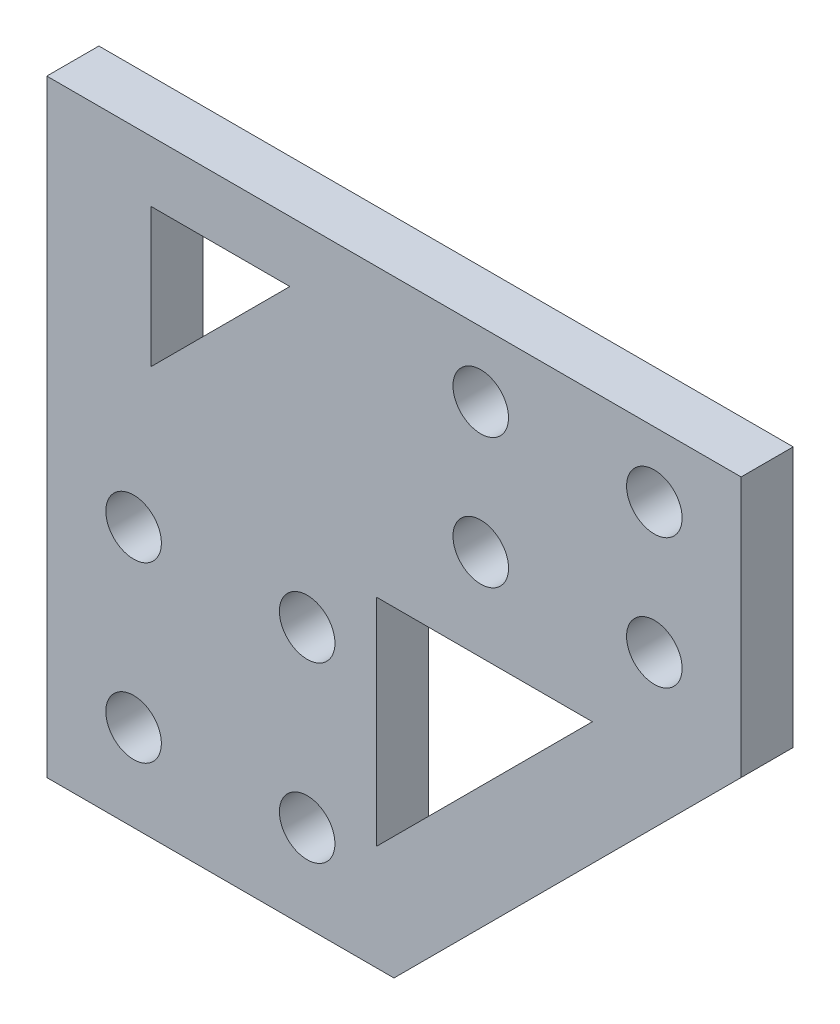
ISO-10303-21;
HEADER;
FILE_DESCRIPTION(('STEP AP214'),'2;1');
FILE_NAME('part.step','',(''),(''),'','','');
FILE_SCHEMA(('AUTOMOTIVE_DESIGN { 1 0 10303 214 1 1 1 1 }'));
ENDSEC;
DATA;
#1=APPLICATION_CONTEXT('core data for automotive mechanical design processes');
#2=APPLICATION_PROTOCOL_DEFINITION('international standard','automotive_design',2000,#1);
#3=PRODUCT_CONTEXT('',#1,'mechanical');
#4=PRODUCT('Part','Part','',(#3));
#5=PRODUCT_RELATED_PRODUCT_CATEGORY('part','',(#4));
#6=PRODUCT_DEFINITION_FORMATION('','',#4);
#7=PRODUCT_DEFINITION_CONTEXT('part definition',#1,'design');
#8=PRODUCT_DEFINITION('design','',#6,#7);
#9=PRODUCT_DEFINITION_SHAPE('','',#8);
#10=(LENGTH_UNIT() NAMED_UNIT(*) SI_UNIT(.MILLI.,.METRE.));
#11=(NAMED_UNIT(*) PLANE_ANGLE_UNIT() SI_UNIT($,.RADIAN.));
#12=(NAMED_UNIT(*) SI_UNIT($,.STERADIAN.) SOLID_ANGLE_UNIT());
#13=UNCERTAINTY_MEASURE_WITH_UNIT(LENGTH_MEASURE(1.E-05),#10,'distance_accuracy_value','');
#14=(GEOMETRIC_REPRESENTATION_CONTEXT(3) GLOBAL_UNCERTAINTY_ASSIGNED_CONTEXT((#13)) GLOBAL_UNIT_ASSIGNED_CONTEXT((#10,
#11,#12)) REPRESENTATION_CONTEXT('',''));
#15=CARTESIAN_POINT('',(0.,0.,0.));
#16=DIRECTION('',(0.,0.,1.));
#17=DIRECTION('',(1.,0.,0.));
#18=AXIS2_PLACEMENT_3D('',#15,#16,#17);
#19=CARTESIAN_POINT('',(0.,0.,3.));
#20=DIRECTION('',(0.,0.,-1.));
#21=DIRECTION('',(-1.,0.,0.));
#22=AXIS2_PLACEMENT_3D('',#19,#20,#21);
#23=PLANE('',#22);
#24=DIRECTION('',(-1.,0.,0.));
#25=VECTOR('',#24,1.);
#26=CARTESIAN_POINT('',(31.4289321881345,-16.5,3.));
#27=LINE('',#26,#25);
#28=CARTESIAN_POINT('',(31.4289321881345,-16.5,3.));
#29=VERTEX_POINT('',#28);
#30=CARTESIAN_POINT('',(19.,-16.5,3.));
#31=VERTEX_POINT('',#30);
#32=EDGE_CURVE('E163',#29,#31,#27,.T.);
#33=ORIENTED_EDGE('',*,*,#32,.F.);
#34=DIRECTION('',(0.707106781186547,0.707106781186548,0.));
#35=VECTOR('',#34,1.);
#36=CARTESIAN_POINT('',(19.,-28.9289321881345,3.));
#37=LINE('',#36,#35);
#38=CARTESIAN_POINT('',(19.,-28.9289321881345,3.));
#39=VERTEX_POINT('',#38);
#40=EDGE_CURVE('E171',#39,#29,#37,.T.);
#41=ORIENTED_EDGE('',*,*,#40,.F.);
#42=DIRECTION('',(0.,-1.,0.));
#43=VECTOR('',#42,1.);
#44=CARTESIAN_POINT('',(19.,-16.5,3.));
#45=LINE('',#44,#43);
#46=EDGE_CURVE('E166',#31,#39,#45,.T.);
#47=ORIENTED_EDGE('',*,*,#46,.F.);
#48=EDGE_LOOP('',(#33,#41,#47));
#49=FACE_BOUND('',#48,.T.);
#50=DIRECTION('',(0.,-1.,0.));
#51=VECTOR('',#50,1.);
#52=CARTESIAN_POINT('',(0.,-35.,3.));
#53=LINE('',#52,#51);
#54=CARTESIAN_POINT('',(0.,0.,3.));
#55=VERTEX_POINT('',#54);
#56=CARTESIAN_POINT('',(0.,-35.,3.));
#57=VERTEX_POINT('',#56);
#58=EDGE_CURVE('E260',#55,#57,#53,.T.);
#59=ORIENTED_EDGE('',*,*,#58,.T.);
#60=DIRECTION('',(1.,0.,0.));
#61=VECTOR('',#60,1.);
#62=CARTESIAN_POINT('',(20.,-35.,3.));
#63=LINE('',#62,#61);
#64=CARTESIAN_POINT('',(20.,-35.,3.));
#65=VERTEX_POINT('',#64);
#66=EDGE_CURVE('E264',#57,#65,#63,.T.);
#67=ORIENTED_EDGE('',*,*,#66,.T.);
#68=DIRECTION('',(0.707106781186547,0.707106781186548,0.));
#69=VECTOR('',#68,1.);
#70=CARTESIAN_POINT('',(40.,-15.,3.));
#71=LINE('',#70,#69);
#72=CARTESIAN_POINT('',(40.,-15.,3.));
#73=VERTEX_POINT('',#72);
#74=EDGE_CURVE('E268',#65,#73,#71,.T.);
#75=ORIENTED_EDGE('',*,*,#74,.T.);
#76=DIRECTION('',(0.,1.,0.));
#77=VECTOR('',#76,1.);
#78=CARTESIAN_POINT('',(40.,0.,3.));
#79=LINE('',#78,#77);
#80=CARTESIAN_POINT('',(40.,0.,3.));
#81=VERTEX_POINT('',#80);
#82=EDGE_CURVE('E271',#73,#81,#79,.T.);
#83=ORIENTED_EDGE('',*,*,#82,.T.);
#84=DIRECTION('',(-1.,0.,0.));
#85=VECTOR('',#84,1.);
#86=CARTESIAN_POINT('',(0.,0.,3.));
#87=LINE('',#86,#85);
#88=EDGE_CURVE('E274',#81,#55,#87,.T.);
#89=ORIENTED_EDGE('',*,*,#88,.T.);
#90=EDGE_LOOP('',(#59,#67,#75,#83,#89));
#91=FACE_BOUND('',#90,.T.);
#92=CARTESIAN_POINT('',(5.00000000000001,-30.,3.));
#93=DIRECTION('',(0.,0.,1.));
#94=DIRECTION('',(1.,0.,0.));
#95=AXIS2_PLACEMENT_3D('',#92,#93,#94);
#96=CIRCLE('',#95,1.59999999999999);
#97=CARTESIAN_POINT('',(6.6,-30.,3.));
#98=VERTEX_POINT('',#97);
#99=EDGE_CURVE('E252',#98,#98,#96,.T.);
#100=ORIENTED_EDGE('',*,*,#99,.F.);
#101=EDGE_LOOP('',(#100));
#102=FACE_BOUND('',#101,.T.);
#103=CARTESIAN_POINT('',(15.,-30.,3.));
#104=DIRECTION('',(0.,0.,1.));
#105=DIRECTION('',(-1.,0.,0.));
#106=AXIS2_PLACEMENT_3D('',#103,#104,#105);
#107=CIRCLE('',#106,1.6);
#108=CARTESIAN_POINT('',(13.4,-30.,3.));
#109=VERTEX_POINT('',#108);
#110=EDGE_CURVE('E244',#109,#109,#107,.T.);
#111=ORIENTED_EDGE('',*,*,#110,.F.);
#112=EDGE_LOOP('',(#111));
#113=FACE_BOUND('',#112,.T.);
#114=CARTESIAN_POINT('',(15.,-20.,3.));
#115=DIRECTION('',(0.,0.,1.));
#116=DIRECTION('',(1.,0.,0.));
#117=AXIS2_PLACEMENT_3D('',#114,#115,#116);
#118=CIRCLE('',#117,1.6);
#119=CARTESIAN_POINT('',(16.6,-20.,3.));
#120=VERTEX_POINT('',#119);
#121=EDGE_CURVE('E236',#120,#120,#118,.T.);
#122=ORIENTED_EDGE('',*,*,#121,.F.);
#123=EDGE_LOOP('',(#122));
#124=FACE_BOUND('',#123,.T.);
#125=CARTESIAN_POINT('',(5.00000000000001,-20.,3.));
#126=DIRECTION('',(0.,0.,1.));
#127=DIRECTION('',(-1.,0.,0.));
#128=AXIS2_PLACEMENT_3D('',#125,#126,#127);
#129=CIRCLE('',#128,1.6);
#130=CARTESIAN_POINT('',(3.40000000000001,-20.,3.));
#131=VERTEX_POINT('',#130);
#132=EDGE_CURVE('E228',#131,#131,#129,.T.);
#133=ORIENTED_EDGE('',*,*,#132,.F.);
#134=EDGE_LOOP('',(#133));
#135=FACE_BOUND('',#134,.T.);
#136=CARTESIAN_POINT('',(35.,-3.75,3.));
#137=DIRECTION('',(0.,0.,1.));
#138=DIRECTION('',(1.,0.,0.));
#139=AXIS2_PLACEMENT_3D('',#136,#137,#138);
#140=CIRCLE('',#139,1.6);
#141=CARTESIAN_POINT('',(36.6,-3.75,3.));
#142=VERTEX_POINT('',#141);
#143=EDGE_CURVE('E220',#142,#142,#140,.T.);
#144=ORIENTED_EDGE('',*,*,#143,.F.);
#145=EDGE_LOOP('',(#144));
#146=FACE_BOUND('',#145,.T.);
#147=CARTESIAN_POINT('',(35.,-11.25,3.));
#148=DIRECTION('',(0.,0.,1.));
#149=DIRECTION('',(-1.,0.,0.));
#150=AXIS2_PLACEMENT_3D('',#147,#148,#149);
#151=CIRCLE('',#150,1.6);
#152=CARTESIAN_POINT('',(33.4,-11.25,3.));
#153=VERTEX_POINT('',#152);
#154=EDGE_CURVE('E212',#153,#153,#151,.T.);
#155=ORIENTED_EDGE('',*,*,#154,.F.);
#156=EDGE_LOOP('',(#155));
#157=FACE_BOUND('',#156,.T.);
#158=CARTESIAN_POINT('',(25.,-11.25,3.));
#159=DIRECTION('',(0.,0.,1.));
#160=DIRECTION('',(1.,0.,0.));
#161=AXIS2_PLACEMENT_3D('',#158,#159,#160);
#162=CIRCLE('',#161,1.6);
#163=CARTESIAN_POINT('',(26.6,-11.25,3.));
#164=VERTEX_POINT('',#163);
#165=EDGE_CURVE('E204',#164,#164,#162,.T.);
#166=ORIENTED_EDGE('',*,*,#165,.F.);
#167=EDGE_LOOP('',(#166));
#168=FACE_BOUND('',#167,.T.);
#169=CARTESIAN_POINT('',(25.,-3.75,3.));
#170=DIRECTION('',(0.,0.,1.));
#171=DIRECTION('',(-1.,0.,0.));
#172=AXIS2_PLACEMENT_3D('',#169,#170,#171);
#173=CIRCLE('',#172,1.6);
#174=CARTESIAN_POINT('',(23.4,-3.75,3.));
#175=VERTEX_POINT('',#174);
#176=EDGE_CURVE('E196',#175,#175,#173,.T.);
#177=ORIENTED_EDGE('',*,*,#176,.F.);
#178=EDGE_LOOP('',(#177));
#179=FACE_BOUND('',#178,.T.);
#180=DIRECTION('',(0.,-1.,0.));
#181=VECTOR('',#180,1.);
#182=CARTESIAN_POINT('',(6.,-3.5,3.));
#183=LINE('',#182,#181);
#184=CARTESIAN_POINT('',(6.,-3.5,3.));
#185=VERTEX_POINT('',#184);
#186=CARTESIAN_POINT('',(6.,-11.5,3.));
#187=VERTEX_POINT('',#186);
#188=EDGE_CURVE('E127',#185,#187,#183,.T.);
#189=ORIENTED_EDGE('',*,*,#188,.F.);
#190=DIRECTION('',(-1.,0.,0.));
#191=VECTOR('',#190,1.);
#192=CARTESIAN_POINT('',(6.,-3.5,3.));
#193=LINE('',#192,#191);
#194=CARTESIAN_POINT('',(14.,-3.5,3.));
#195=VERTEX_POINT('',#194);
#196=EDGE_CURVE('E146',#195,#185,#193,.T.);
#197=ORIENTED_EDGE('',*,*,#196,.F.);
#198=DIRECTION('',(0.707106781186547,0.707106781186548,0.));
#199=VECTOR('',#198,1.);
#200=CARTESIAN_POINT('',(14.,-3.5,3.));
#201=LINE('',#200,#199);
#202=EDGE_CURVE('E136',#187,#195,#201,.T.);
#203=ORIENTED_EDGE('',*,*,#202,.F.);
#204=EDGE_LOOP('',(#189,#197,#203));
#205=FACE_BOUND('',#204,.T.);
#206=ADVANCED_FACE('F43',(#49,#91,#102,#113,#124,#135,#146,#157,#168,#179,#205),#23,.F.);
#207=CARTESIAN_POINT('',(0.,0.,0.));
#208=DIRECTION('',(0.,0.,-1.));
#209=DIRECTION('',(-1.,0.,0.));
#210=AXIS2_PLACEMENT_3D('',#207,#208,#209);
#211=PLANE('',#210);
#212=CARTESIAN_POINT('',(25.,-11.25,0.));
#213=DIRECTION('',(0.,0.,1.));
#214=DIRECTION('',(1.,0.,0.));
#215=AXIS2_PLACEMENT_3D('',#212,#213,#214);
#216=CIRCLE('',#215,1.6);
#217=CARTESIAN_POINT('',(26.6,-11.25,0.));
#218=VERTEX_POINT('',#217);
#219=EDGE_CURVE('E200',#218,#218,#216,.T.);
#220=ORIENTED_EDGE('',*,*,#219,.T.);
#221=EDGE_LOOP('',(#220));
#222=FACE_BOUND('',#221,.T.);
#223=CARTESIAN_POINT('',(35.,-3.75,0.));
#224=DIRECTION('',(0.,0.,1.));
#225=DIRECTION('',(1.,0.,0.));
#226=AXIS2_PLACEMENT_3D('',#223,#224,#225);
#227=CIRCLE('',#226,1.6);
#228=CARTESIAN_POINT('',(36.6,-3.75,0.));
#229=VERTEX_POINT('',#228);
#230=EDGE_CURVE('E216',#229,#229,#227,.T.);
#231=ORIENTED_EDGE('',*,*,#230,.T.);
#232=EDGE_LOOP('',(#231));
#233=FACE_BOUND('',#232,.T.);
#234=CARTESIAN_POINT('',(15.,-20.,0.));
#235=DIRECTION('',(0.,0.,1.));
#236=DIRECTION('',(1.,0.,0.));
#237=AXIS2_PLACEMENT_3D('',#234,#235,#236);
#238=CIRCLE('',#237,1.6);
#239=CARTESIAN_POINT('',(16.6,-20.,0.));
#240=VERTEX_POINT('',#239);
#241=EDGE_CURVE('E232',#240,#240,#238,.T.);
#242=ORIENTED_EDGE('',*,*,#241,.T.);
#243=EDGE_LOOP('',(#242));
#244=FACE_BOUND('',#243,.T.);
#245=CARTESIAN_POINT('',(5.00000000000001,-30.,0.));
#246=DIRECTION('',(0.,0.,1.));
#247=DIRECTION('',(1.,0.,0.));
#248=AXIS2_PLACEMENT_3D('',#245,#246,#247);
#249=CIRCLE('',#248,1.59999999999999);
#250=CARTESIAN_POINT('',(6.6,-30.,0.));
#251=VERTEX_POINT('',#250);
#252=EDGE_CURVE('E248',#251,#251,#249,.T.);
#253=ORIENTED_EDGE('',*,*,#252,.T.);
#254=EDGE_LOOP('',(#253));
#255=FACE_BOUND('',#254,.T.);
#256=DIRECTION('',(0.,-1.,0.));
#257=VECTOR('',#256,1.);
#258=CARTESIAN_POINT('',(0.,-35.,0.));
#259=LINE('',#258,#257);
#260=CARTESIAN_POINT('',(0.,0.,0.));
#261=VERTEX_POINT('',#260);
#262=CARTESIAN_POINT('',(0.,-35.,0.));
#263=VERTEX_POINT('',#262);
#264=EDGE_CURVE('E256',#261,#263,#259,.T.);
#265=ORIENTED_EDGE('',*,*,#264,.F.);
#266=DIRECTION('',(-1.,0.,0.));
#267=VECTOR('',#266,1.);
#268=CARTESIAN_POINT('',(0.,0.,0.));
#269=LINE('',#268,#267);
#270=CARTESIAN_POINT('',(40.,0.,0.));
#271=VERTEX_POINT('',#270);
#272=EDGE_CURVE('E265',#271,#261,#269,.T.);
#273=ORIENTED_EDGE('',*,*,#272,.F.);
#274=DIRECTION('',(0.,1.,0.));
#275=VECTOR('',#274,1.);
#276=CARTESIAN_POINT('',(40.,0.,0.));
#277=LINE('',#276,#275);
#278=CARTESIAN_POINT('',(40.,-15.,0.));
#279=VERTEX_POINT('',#278);
#280=EDGE_CURVE('E287',#279,#271,#277,.T.);
#281=ORIENTED_EDGE('',*,*,#280,.F.);
#282=DIRECTION('',(0.707106781186547,0.707106781186548,0.));
#283=VECTOR('',#282,1.);
#284=CARTESIAN_POINT('',(40.,-15.,0.));
#285=LINE('',#284,#283);
#286=CARTESIAN_POINT('',(20.,-35.,0.));
#287=VERTEX_POINT('',#286);
#288=EDGE_CURVE('E284',#287,#279,#285,.T.);
#289=ORIENTED_EDGE('',*,*,#288,.F.);
#290=DIRECTION('',(1.,0.,0.));
#291=VECTOR('',#290,1.);
#292=CARTESIAN_POINT('',(20.,-35.,0.));
#293=LINE('',#292,#291);
#294=EDGE_CURVE('E281',#263,#287,#293,.T.);
#295=ORIENTED_EDGE('',*,*,#294,.F.);
#296=EDGE_LOOP('',(#265,#273,#281,#289,#295));
#297=FACE_BOUND('',#296,.T.);
#298=CARTESIAN_POINT('',(15.,-30.,0.));
#299=DIRECTION('',(0.,0.,1.));
#300=DIRECTION('',(-1.,0.,0.));
#301=AXIS2_PLACEMENT_3D('',#298,#299,#300);
#302=CIRCLE('',#301,1.6);
#303=CARTESIAN_POINT('',(13.4,-30.,0.));
#304=VERTEX_POINT('',#303);
#305=EDGE_CURVE('E240',#304,#304,#302,.T.);
#306=ORIENTED_EDGE('',*,*,#305,.T.);
#307=EDGE_LOOP('',(#306));
#308=FACE_BOUND('',#307,.T.);
#309=CARTESIAN_POINT('',(5.00000000000001,-20.,0.));
#310=DIRECTION('',(0.,0.,1.));
#311=DIRECTION('',(-1.,0.,0.));
#312=AXIS2_PLACEMENT_3D('',#309,#310,#311);
#313=CIRCLE('',#312,1.6);
#314=CARTESIAN_POINT('',(3.40000000000001,-20.,0.));
#315=VERTEX_POINT('',#314);
#316=EDGE_CURVE('E224',#315,#315,#313,.T.);
#317=ORIENTED_EDGE('',*,*,#316,.T.);
#318=EDGE_LOOP('',(#317));
#319=FACE_BOUND('',#318,.T.);
#320=CARTESIAN_POINT('',(35.,-11.25,0.));
#321=DIRECTION('',(0.,0.,1.));
#322=DIRECTION('',(-1.,0.,0.));
#323=AXIS2_PLACEMENT_3D('',#320,#321,#322);
#324=CIRCLE('',#323,1.6);
#325=CARTESIAN_POINT('',(33.4,-11.25,0.));
#326=VERTEX_POINT('',#325);
#327=EDGE_CURVE('E208',#326,#326,#324,.T.);
#328=ORIENTED_EDGE('',*,*,#327,.T.);
#329=EDGE_LOOP('',(#328));
#330=FACE_BOUND('',#329,.T.);
#331=CARTESIAN_POINT('',(25.,-3.75,0.));
#332=DIRECTION('',(0.,0.,1.));
#333=DIRECTION('',(-1.,0.,0.));
#334=AXIS2_PLACEMENT_3D('',#331,#332,#333);
#335=CIRCLE('',#334,1.6);
#336=CARTESIAN_POINT('',(23.4,-3.75,0.));
#337=VERTEX_POINT('',#336);
#338=EDGE_CURVE('E195',#337,#337,#335,.T.);
#339=ORIENTED_EDGE('',*,*,#338,.T.);
#340=EDGE_LOOP('',(#339));
#341=FACE_BOUND('',#340,.T.);
#342=DIRECTION('',(0.707106781186547,0.707106781186548,0.));
#343=VECTOR('',#342,1.);
#344=CARTESIAN_POINT('',(19.,-28.9289321881345,0.));
#345=LINE('',#344,#343);
#346=CARTESIAN_POINT('',(19.,-28.9289321881345,0.));
#347=VERTEX_POINT('',#346);
#348=CARTESIAN_POINT('',(31.4289321881345,-16.5,0.));
#349=VERTEX_POINT('',#348);
#350=EDGE_CURVE('E167',#347,#349,#345,.T.);
#351=ORIENTED_EDGE('',*,*,#350,.T.);
#352=DIRECTION('',(-1.,0.,0.));
#353=VECTOR('',#352,1.);
#354=CARTESIAN_POINT('',(31.4289321881345,-16.5,0.));
#355=LINE('',#354,#353);
#356=CARTESIAN_POINT('',(19.,-16.5,0.));
#357=VERTEX_POINT('',#356);
#358=EDGE_CURVE('E144',#349,#357,#355,.T.);
#359=ORIENTED_EDGE('',*,*,#358,.T.);
#360=DIRECTION('',(0.,-1.,0.));
#361=VECTOR('',#360,1.);
#362=CARTESIAN_POINT('',(19.,-16.5,0.));
#363=LINE('',#362,#361);
#364=EDGE_CURVE('E178',#357,#347,#363,.T.);
#365=ORIENTED_EDGE('',*,*,#364,.T.);
#366=EDGE_LOOP('',(#351,#359,#365));
#367=FACE_BOUND('',#366,.T.);
#368=DIRECTION('',(-1.,0.,0.));
#369=VECTOR('',#368,1.);
#370=CARTESIAN_POINT('',(6.,-3.5,0.));
#371=LINE('',#370,#369);
#372=CARTESIAN_POINT('',(14.,-3.5,0.));
#373=VERTEX_POINT('',#372);
#374=CARTESIAN_POINT('',(6.,-3.5,0.));
#375=VERTEX_POINT('',#374);
#376=EDGE_CURVE('E137',#373,#375,#371,.T.);
#377=ORIENTED_EDGE('',*,*,#376,.T.);
#378=DIRECTION('',(0.,-1.,0.));
#379=VECTOR('',#378,1.);
#380=CARTESIAN_POINT('',(6.,-3.5,0.));
#381=LINE('',#380,#379);
#382=CARTESIAN_POINT('',(6.,-11.5,0.));
#383=VERTEX_POINT('',#382);
#384=EDGE_CURVE('E67',#375,#383,#381,.T.);
#385=ORIENTED_EDGE('',*,*,#384,.T.);
#386=DIRECTION('',(0.707106781186547,0.707106781186548,0.));
#387=VECTOR('',#386,1.);
#388=CARTESIAN_POINT('',(14.,-3.5,0.));
#389=LINE('',#388,#387);
#390=EDGE_CURVE('E142',#383,#373,#389,.T.);
#391=ORIENTED_EDGE('',*,*,#390,.T.);
#392=EDGE_LOOP('',(#377,#385,#391));
#393=FACE_BOUND('',#392,.T.);
#394=ADVANCED_FACE('F314',(#222,#233,#244,#255,#297,#308,#319,#330,#341,#367,#393),#211,.T.);
#395=CARTESIAN_POINT('',(0.,-35.,3.));
#396=DIRECTION('',(1.,0.,0.));
#397=DIRECTION('',(0.,1.,0.));
#398=AXIS2_PLACEMENT_3D('',#395,#396,#397);
#399=PLANE('',#398);
#400=ORIENTED_EDGE('',*,*,#264,.T.);
#401=DIRECTION('',(0.,0.,-1.));
#402=VECTOR('',#401,1.);
#403=CARTESIAN_POINT('',(0.,-35.,3.));
#404=LINE('',#403,#402);
#405=EDGE_CURVE('E11',#57,#263,#404,.T.);
#406=ORIENTED_EDGE('',*,*,#405,.F.);
#407=ORIENTED_EDGE('',*,*,#58,.F.);
#408=DIRECTION('',(0.,0.,-1.));
#409=VECTOR('',#408,1.);
#410=CARTESIAN_POINT('',(0.,0.,3.));
#411=LINE('',#410,#409);
#412=EDGE_CURVE('E277',#55,#261,#411,.T.);
#413=ORIENTED_EDGE('',*,*,#412,.T.);
#414=EDGE_LOOP('',(#400,#406,#407,#413));
#415=FACE_BOUND('',#414,.T.);
#416=ADVANCED_FACE('F45',(#415),#399,.F.);
#417=CARTESIAN_POINT('',(20.,-35.,3.));
#418=DIRECTION('',(0.,1.,0.));
#419=DIRECTION('',(0.,0.,1.));
#420=AXIS2_PLACEMENT_3D('',#417,#418,#419);
#421=PLANE('',#420);
#422=ORIENTED_EDGE('',*,*,#294,.T.);
#423=DIRECTION('',(0.,0.,-1.));
#424=VECTOR('',#423,1.);
#425=CARTESIAN_POINT('',(20.,-35.,3.));
#426=LINE('',#425,#424);
#427=EDGE_CURVE('E52',#65,#287,#426,.T.);
#428=ORIENTED_EDGE('',*,*,#427,.F.);
#429=ORIENTED_EDGE('',*,*,#66,.F.);
#430=ORIENTED_EDGE('',*,*,#405,.T.);
#431=EDGE_LOOP('',(#422,#428,#429,#430));
#432=FACE_BOUND('',#431,.T.);
#433=ADVANCED_FACE('F329',(#432),#421,.F.);
#434=CARTESIAN_POINT('',(40.,-15.,3.));
#435=DIRECTION('',(-0.707106781186548,0.707106781186547,0.));
#436=DIRECTION('',(-0.707106781186547,-0.707106781186548,0.));
#437=AXIS2_PLACEMENT_3D('',#434,#435,#436);
#438=PLANE('',#437);
#439=ORIENTED_EDGE('',*,*,#288,.T.);
#440=DIRECTION('',(0.,0.,-1.));
#441=VECTOR('',#440,1.);
#442=CARTESIAN_POINT('',(40.,-15.,3.));
#443=LINE('',#442,#441);
#444=EDGE_CURVE('E299',#73,#279,#443,.T.);
#445=ORIENTED_EDGE('',*,*,#444,.F.);
#446=ORIENTED_EDGE('',*,*,#74,.F.);
#447=ORIENTED_EDGE('',*,*,#427,.T.);
#448=EDGE_LOOP('',(#439,#445,#446,#447));
#449=FACE_BOUND('',#448,.T.);
#450=ADVANCED_FACE('F308',(#449),#438,.F.);
#451=CARTESIAN_POINT('',(40.,0.,3.));
#452=DIRECTION('',(-1.,0.,0.));
#453=DIRECTION('',(0.,0.,1.));
#454=AXIS2_PLACEMENT_3D('',#451,#452,#453);
#455=PLANE('',#454);
#456=ORIENTED_EDGE('',*,*,#280,.T.);
#457=DIRECTION('',(0.,0.,-1.));
#458=VECTOR('',#457,1.);
#459=CARTESIAN_POINT('',(40.,0.,3.));
#460=LINE('',#459,#458);
#461=EDGE_CURVE('E295',#81,#271,#460,.T.);
#462=ORIENTED_EDGE('',*,*,#461,.F.);
#463=ORIENTED_EDGE('',*,*,#82,.F.);
#464=ORIENTED_EDGE('',*,*,#444,.T.);
#465=EDGE_LOOP('',(#456,#462,#463,#464));
#466=FACE_BOUND('',#465,.T.);
#467=ADVANCED_FACE('F319',(#466),#455,.F.);
#468=CARTESIAN_POINT('',(0.,0.,3.));
#469=DIRECTION('',(0.,-1.,0.));
#470=DIRECTION('',(0.,0.,-1.));
#471=AXIS2_PLACEMENT_3D('',#468,#469,#470);
#472=PLANE('',#471);
#473=ORIENTED_EDGE('',*,*,#272,.T.);
#474=ORIENTED_EDGE('',*,*,#412,.F.);
#475=ORIENTED_EDGE('',*,*,#88,.F.);
#476=ORIENTED_EDGE('',*,*,#461,.T.);
#477=EDGE_LOOP('',(#473,#474,#475,#476));
#478=FACE_BOUND('',#477,.T.);
#479=ADVANCED_FACE('F323',(#478),#472,.F.);
#480=CARTESIAN_POINT('',(5.00000000000001,-30.,3.));
#481=DIRECTION('',(0.,0.,-1.));
#482=DIRECTION('',(-1.,0.,0.));
#483=AXIS2_PLACEMENT_3D('',#480,#481,#482);
#484=CYLINDRICAL_SURFACE('',#483,1.59999999999999);
#485=ORIENTED_EDGE('',*,*,#99,.T.);
#486=EDGE_LOOP('',(#485));
#487=FACE_BOUND('',#486,.T.);
#488=ORIENTED_EDGE('',*,*,#252,.F.);
#489=EDGE_LOOP('',(#488));
#490=FACE_BOUND('',#489,.T.);
#491=ADVANCED_FACE('F345',(#487,#490),#484,.F.);
#492=CARTESIAN_POINT('',(15.,-30.,3.));
#493=DIRECTION('',(0.,0.,-1.));
#494=DIRECTION('',(-1.,0.,0.));
#495=AXIS2_PLACEMENT_3D('',#492,#493,#494);
#496=CYLINDRICAL_SURFACE('',#495,1.6);
#497=ORIENTED_EDGE('',*,*,#110,.T.);
#498=EDGE_LOOP('',(#497));
#499=FACE_BOUND('',#498,.T.);
#500=ORIENTED_EDGE('',*,*,#305,.F.);
#501=EDGE_LOOP('',(#500));
#502=FACE_BOUND('',#501,.T.);
#503=ADVANCED_FACE('F371',(#499,#502),#496,.F.);
#504=CARTESIAN_POINT('',(15.,-20.,3.));
#505=DIRECTION('',(0.,0.,-1.));
#506=DIRECTION('',(-1.,0.,0.));
#507=AXIS2_PLACEMENT_3D('',#504,#505,#506);
#508=CYLINDRICAL_SURFACE('',#507,1.6);
#509=ORIENTED_EDGE('',*,*,#121,.T.);
#510=EDGE_LOOP('',(#509));
#511=FACE_BOUND('',#510,.T.);
#512=ORIENTED_EDGE('',*,*,#241,.F.);
#513=EDGE_LOOP('',(#512));
#514=FACE_BOUND('',#513,.T.);
#515=ADVANCED_FACE('F378',(#511,#514),#508,.F.);
#516=CARTESIAN_POINT('',(5.00000000000001,-20.,3.));
#517=DIRECTION('',(0.,0.,-1.));
#518=DIRECTION('',(-1.,0.,0.));
#519=AXIS2_PLACEMENT_3D('',#516,#517,#518);
#520=CYLINDRICAL_SURFACE('',#519,1.6);
#521=ORIENTED_EDGE('',*,*,#132,.T.);
#522=EDGE_LOOP('',(#521));
#523=FACE_BOUND('',#522,.T.);
#524=ORIENTED_EDGE('',*,*,#316,.F.);
#525=EDGE_LOOP('',(#524));
#526=FACE_BOUND('',#525,.T.);
#527=ADVANCED_FACE('F385',(#523,#526),#520,.F.);
#528=CARTESIAN_POINT('',(35.,-3.75,3.));
#529=DIRECTION('',(0.,0.,-1.));
#530=DIRECTION('',(-1.,0.,0.));
#531=AXIS2_PLACEMENT_3D('',#528,#529,#530);
#532=CYLINDRICAL_SURFACE('',#531,1.6);
#533=ORIENTED_EDGE('',*,*,#143,.T.);
#534=EDGE_LOOP('',(#533));
#535=FACE_BOUND('',#534,.T.);
#536=ORIENTED_EDGE('',*,*,#230,.F.);
#537=EDGE_LOOP('',(#536));
#538=FACE_BOUND('',#537,.T.);
#539=ADVANCED_FACE('F393',(#535,#538),#532,.F.);
#540=CARTESIAN_POINT('',(35.,-11.25,3.));
#541=DIRECTION('',(0.,0.,-1.));
#542=DIRECTION('',(-1.,0.,0.));
#543=AXIS2_PLACEMENT_3D('',#540,#541,#542);
#544=CYLINDRICAL_SURFACE('',#543,1.6);
#545=ORIENTED_EDGE('',*,*,#154,.T.);
#546=EDGE_LOOP('',(#545));
#547=FACE_BOUND('',#546,.T.);
#548=ORIENTED_EDGE('',*,*,#327,.F.);
#549=EDGE_LOOP('',(#548));
#550=FACE_BOUND('',#549,.T.);
#551=ADVANCED_FACE('F401',(#547,#550),#544,.F.);
#552=CARTESIAN_POINT('',(25.,-11.25,3.));
#553=DIRECTION('',(0.,0.,-1.));
#554=DIRECTION('',(-1.,0.,0.));
#555=AXIS2_PLACEMENT_3D('',#552,#553,#554);
#556=CYLINDRICAL_SURFACE('',#555,1.6);
#557=ORIENTED_EDGE('',*,*,#165,.T.);
#558=EDGE_LOOP('',(#557));
#559=FACE_BOUND('',#558,.T.);
#560=ORIENTED_EDGE('',*,*,#219,.F.);
#561=EDGE_LOOP('',(#560));
#562=FACE_BOUND('',#561,.T.);
#563=ADVANCED_FACE('F409',(#559,#562),#556,.F.);
#564=CARTESIAN_POINT('',(25.,-3.75,3.));
#565=DIRECTION('',(0.,0.,-1.));
#566=DIRECTION('',(-1.,0.,0.));
#567=AXIS2_PLACEMENT_3D('',#564,#565,#566);
#568=CYLINDRICAL_SURFACE('',#567,1.6);
#569=ORIENTED_EDGE('',*,*,#176,.T.);
#570=EDGE_LOOP('',(#569));
#571=FACE_BOUND('',#570,.T.);
#572=ORIENTED_EDGE('',*,*,#338,.F.);
#573=EDGE_LOOP('',(#572));
#574=FACE_BOUND('',#573,.T.);
#575=ADVANCED_FACE('F417',(#571,#574),#568,.F.);
#576=CARTESIAN_POINT('',(31.4289321881345,-16.5,3.));
#577=DIRECTION('',(0.,-1.,0.));
#578=DIRECTION('',(1.,0.,0.));
#579=AXIS2_PLACEMENT_3D('',#576,#577,#578);
#580=PLANE('',#579);
#581=ORIENTED_EDGE('',*,*,#358,.F.);
#582=DIRECTION('',(0.,0.,-1.));
#583=VECTOR('',#582,1.);
#584=CARTESIAN_POINT('',(31.4289321881345,-16.5,3.));
#585=LINE('',#584,#583);
#586=EDGE_CURVE('E174',#29,#349,#585,.T.);
#587=ORIENTED_EDGE('',*,*,#586,.F.);
#588=ORIENTED_EDGE('',*,*,#32,.T.);
#589=DIRECTION('',(0.,0.,-1.));
#590=VECTOR('',#589,1.);
#591=CARTESIAN_POINT('',(19.,-16.5,3.));
#592=LINE('',#591,#590);
#593=EDGE_CURVE('E191',#31,#357,#592,.T.);
#594=ORIENTED_EDGE('',*,*,#593,.T.);
#595=EDGE_LOOP('',(#581,#587,#588,#594));
#596=FACE_BOUND('',#595,.T.);
#597=ADVANCED_FACE('F425',(#596),#580,.T.);
#598=CARTESIAN_POINT('',(19.,-16.5,3.));
#599=DIRECTION('',(1.,0.,0.));
#600=DIRECTION('',(0.,0.,-1.));
#601=AXIS2_PLACEMENT_3D('',#598,#599,#600);
#602=PLANE('',#601);
#603=ORIENTED_EDGE('',*,*,#364,.F.);
#604=ORIENTED_EDGE('',*,*,#593,.F.);
#605=ORIENTED_EDGE('',*,*,#46,.T.);
#606=DIRECTION('',(0.,0.,-1.));
#607=VECTOR('',#606,1.);
#608=CARTESIAN_POINT('',(19.,-28.9289321881345,3.));
#609=LINE('',#608,#607);
#610=EDGE_CURVE('E188',#39,#347,#609,.T.);
#611=ORIENTED_EDGE('',*,*,#610,.T.);
#612=EDGE_LOOP('',(#603,#604,#605,#611));
#613=FACE_BOUND('',#612,.T.);
#614=ADVANCED_FACE('F433',(#613),#602,.T.);
#615=CARTESIAN_POINT('',(19.,-28.9289321881345,3.));
#616=DIRECTION('',(-0.707106781186548,0.707106781186547,0.));
#617=DIRECTION('',(-0.707106781186547,-0.707106781186548,0.));
#618=AXIS2_PLACEMENT_3D('',#615,#616,#617);
#619=PLANE('',#618);
#620=ORIENTED_EDGE('',*,*,#350,.F.);
#621=ORIENTED_EDGE('',*,*,#610,.F.);
#622=ORIENTED_EDGE('',*,*,#40,.T.);
#623=ORIENTED_EDGE('',*,*,#586,.T.);
#624=EDGE_LOOP('',(#620,#621,#622,#623));
#625=FACE_BOUND('',#624,.T.);
#626=ADVANCED_FACE('F441',(#625),#619,.T.);
#627=CARTESIAN_POINT('',(6.,-3.5,3.));
#628=DIRECTION('',(1.,0.,0.));
#629=DIRECTION('',(0.,1.,0.));
#630=AXIS2_PLACEMENT_3D('',#627,#628,#629);
#631=PLANE('',#630);
#632=ORIENTED_EDGE('',*,*,#384,.F.);
#633=DIRECTION('',(0.,0.,-1.));
#634=VECTOR('',#633,1.);
#635=CARTESIAN_POINT('',(6.,-3.5,3.));
#636=LINE('',#635,#634);
#637=EDGE_CURVE('E131',#185,#375,#636,.T.);
#638=ORIENTED_EDGE('',*,*,#637,.F.);
#639=ORIENTED_EDGE('',*,*,#188,.T.);
#640=DIRECTION('',(0.,0.,-1.));
#641=VECTOR('',#640,1.);
#642=CARTESIAN_POINT('',(6.,-11.5,3.));
#643=LINE('',#642,#641);
#644=EDGE_CURVE('E130',#187,#383,#643,.T.);
#645=ORIENTED_EDGE('',*,*,#644,.T.);
#646=EDGE_LOOP('',(#632,#638,#639,#645));
#647=FACE_BOUND('',#646,.T.);
#648=ADVANCED_FACE('F129',(#647),#631,.T.);
#649=CARTESIAN_POINT('',(14.,-3.5,3.));
#650=DIRECTION('',(-0.707106781186548,0.707106781186547,0.));
#651=DIRECTION('',(-0.707106781186547,-0.707106781186548,0.));
#652=AXIS2_PLACEMENT_3D('',#649,#650,#651);
#653=PLANE('',#652);
#654=ORIENTED_EDGE('',*,*,#390,.F.);
#655=ORIENTED_EDGE('',*,*,#644,.F.);
#656=ORIENTED_EDGE('',*,*,#202,.T.);
#657=DIRECTION('',(0.,0.,-1.));
#658=VECTOR('',#657,1.);
#659=CARTESIAN_POINT('',(14.,-3.5,3.));
#660=LINE('',#659,#658);
#661=EDGE_CURVE('E59',#195,#373,#660,.T.);
#662=ORIENTED_EDGE('',*,*,#661,.T.);
#663=EDGE_LOOP('',(#654,#655,#656,#662));
#664=FACE_BOUND('',#663,.T.);
#665=ADVANCED_FACE('F140',(#664),#653,.T.);
#666=CARTESIAN_POINT('',(6.,-3.5,3.));
#667=DIRECTION('',(0.,-1.,0.));
#668=DIRECTION('',(1.,0.,0.));
#669=AXIS2_PLACEMENT_3D('',#666,#667,#668);
#670=PLANE('',#669);
#671=ORIENTED_EDGE('',*,*,#376,.F.);
#672=ORIENTED_EDGE('',*,*,#661,.F.);
#673=ORIENTED_EDGE('',*,*,#196,.T.);
#674=ORIENTED_EDGE('',*,*,#637,.T.);
#675=EDGE_LOOP('',(#671,#672,#673,#674));
#676=FACE_BOUND('',#675,.T.);
#677=ADVANCED_FACE('F462',(#676),#670,.T.);
#678=CLOSED_SHELL('',(#206,#394,#416,#433,#450,#467,#479,#491,#503,#515,#527,#539,#551,#563,
#575,#597,#614,#626,#648,#665,#677));
#679=MANIFOLD_SOLID_BREP('B2',#678);
#680=ADVANCED_BREP_SHAPE_REPRESENTATION('',(#18,#679),#14);
#681=SHAPE_DEFINITION_REPRESENTATION(#9,#680);
ENDSEC;
END-ISO-10303-21;
